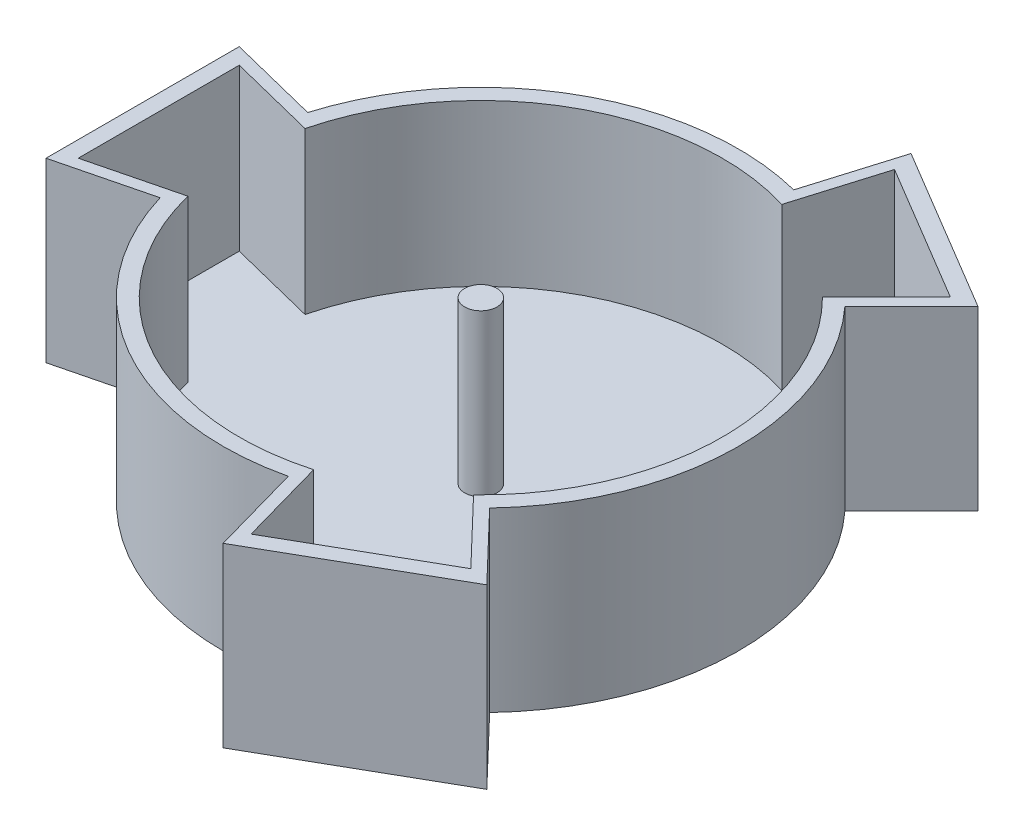
ISO-10303-21;
HEADER;
FILE_DESCRIPTION(('STEP AP214'),'2;1');
FILE_NAME('part.step','',(''),(''),'','','');
FILE_SCHEMA(('AUTOMOTIVE_DESIGN { 1 0 10303 214 1 1 1 1 }'));
ENDSEC;
DATA;
#1=APPLICATION_CONTEXT('core data for automotive mechanical design processes');
#2=APPLICATION_PROTOCOL_DEFINITION('international standard','automotive_design',2000,#1);
#3=PRODUCT_CONTEXT('',#1,'mechanical');
#4=PRODUCT('Part','Part','',(#3));
#5=PRODUCT_RELATED_PRODUCT_CATEGORY('part','',(#4));
#6=PRODUCT_DEFINITION_FORMATION('','',#4);
#7=PRODUCT_DEFINITION_CONTEXT('part definition',#1,'design');
#8=PRODUCT_DEFINITION('design','',#6,#7);
#9=PRODUCT_DEFINITION_SHAPE('','',#8);
#10=(LENGTH_UNIT() NAMED_UNIT(*) SI_UNIT(.MILLI.,.METRE.));
#11=(NAMED_UNIT(*) PLANE_ANGLE_UNIT() SI_UNIT($,.RADIAN.));
#12=(NAMED_UNIT(*) SI_UNIT($,.STERADIAN.) SOLID_ANGLE_UNIT());
#13=UNCERTAINTY_MEASURE_WITH_UNIT(LENGTH_MEASURE(1.E-05),#10,'distance_accuracy_value','');
#14=(GEOMETRIC_REPRESENTATION_CONTEXT(3) GLOBAL_UNCERTAINTY_ASSIGNED_CONTEXT((#13)) GLOBAL_UNIT_ASSIGNED_CONTEXT((#10,
#11,#12)) REPRESENTATION_CONTEXT('',''));
#15=CARTESIAN_POINT('',(0.,0.,0.));
#16=DIRECTION('',(0.,0.,1.));
#17=DIRECTION('',(1.,0.,0.));
#18=AXIS2_PLACEMENT_3D('',#15,#16,#17);
#19=CARTESIAN_POINT('',(1.3343295867125,25.4,-1.27871712868801));
#20=DIRECTION('',(-0.721992365538374,0.,0.691901021898582));
#21=DIRECTION('',(0.691901021898582,0.,0.721992365538374));
#22=AXIS2_PLACEMENT_3D('',#19,#20,#21);
#23=PLANE('',#22);
#24=DIRECTION('',(0.,-1.,0.));
#25=VECTOR('',#24,1.);
#26=CARTESIAN_POINT('',(39.6958434473528,25.4,38.7511704726871));
#27=LINE('',#26,#25);
#28=CARTESIAN_POINT('',(39.6958434473528,25.4,38.7511704726871));
#29=VERTEX_POINT('',#28);
#30=CARTESIAN_POINT('',(39.6958434473528,-2.54,38.7511704726871));
#31=VERTEX_POINT('',#30);
#32=EDGE_CURVE('E259',#29,#31,#27,.T.);
#33=ORIENTED_EDGE('',*,*,#32,.T.);
#34=DIRECTION('',(-0.691901021898582,0.,-0.721992365538374));
#35=VECTOR('',#34,1.);
#36=CARTESIAN_POINT('',(1.3343295867125,-2.54,-1.27871712868801));
#37=LINE('',#36,#35);
#38=CARTESIAN_POINT('',(29.424096963729,-2.54,28.032697299209));
#39=VERTEX_POINT('',#38);
#40=EDGE_CURVE('E760',#31,#39,#37,.T.);
#41=ORIENTED_EDGE('',*,*,#40,.T.);
#42=DIRECTION('',(0.,-1.,0.));
#43=VECTOR('',#42,1.);
#44=CARTESIAN_POINT('',(29.424096963729,25.4,28.032697299209));
#45=LINE('',#44,#43);
#46=CARTESIAN_POINT('',(29.424096963729,25.4,28.032697299209));
#47=VERTEX_POINT('',#46);
#48=EDGE_CURVE('E11',#47,#39,#45,.T.);
#49=ORIENTED_EDGE('',*,*,#48,.F.);
#50=DIRECTION('',(-0.691901021898582,0.,-0.721992365538374));
#51=VECTOR('',#50,1.);
#52=CARTESIAN_POINT('',(1.3343295867125,25.4,-1.27871712868801));
#53=LINE('',#52,#51);
#54=EDGE_CURVE('E381',#29,#47,#53,.T.);
#55=ORIENTED_EDGE('',*,*,#54,.F.);
#56=EDGE_LOOP('',(#33,#41,#49,#55));
#57=FACE_BOUND('',#56,.T.);
#58=ADVANCED_FACE('F50',(#57),#23,.F.);
#59=CARTESIAN_POINT('',(0.,25.4,0.));
#60=DIRECTION('',(0.,-1.,0.));
#61=DIRECTION('',(0.,0.,-1.));
#62=AXIS2_PLACEMENT_3D('',#59,#60,#61);
#63=CYLINDRICAL_SURFACE('',#62,40.64);
#64=ORIENTED_EDGE('',*,*,#48,.T.);
#65=CARTESIAN_POINT('',(0.,-2.54,0.));
#66=DIRECTION('',(0.,1.,0.));
#67=DIRECTION('',(0.,0.,1.));
#68=AXIS2_PLACEMENT_3D('',#65,#66,#67);
#69=CIRCLE('',#68,40.64);
#70=CARTESIAN_POINT('',(29.9423411842583,-2.54,-27.4784607357375));
#71=VERTEX_POINT('',#70);
#72=EDGE_CURVE('E746',#39,#71,#69,.T.);
#73=ORIENTED_EDGE('',*,*,#72,.T.);
#74=DIRECTION('',(0.,-1.,0.));
#75=VECTOR('',#74,1.);
#76=CARTESIAN_POINT('',(29.9423411842583,25.4,-27.4784607357375));
#77=LINE('',#76,#75);
#78=CARTESIAN_POINT('',(29.9423411842583,25.4,-27.4784607357375));
#79=VERTEX_POINT('',#78);
#80=EDGE_CURVE('E59',#79,#71,#77,.T.);
#81=ORIENTED_EDGE('',*,*,#80,.F.);
#82=CARTESIAN_POINT('',(0.,25.4,0.));
#83=DIRECTION('',(0.,1.,0.));
#84=DIRECTION('',(0.,0.,1.));
#85=AXIS2_PLACEMENT_3D('',#82,#83,#84);
#86=CIRCLE('',#85,40.64);
#87=EDGE_CURVE('E383',#47,#79,#86,.T.);
#88=ORIENTED_EDGE('',*,*,#87,.F.);
#89=EDGE_LOOP('',(#64,#73,#81,#88));
#90=FACE_BOUND('',#89,.T.);
#91=ADVANCED_FACE('F453',(#90),#63,.T.);
#92=CARTESIAN_POINT('',(1.31022325226551,25.4,1.30340629521237));
#93=DIRECTION('',(0.708948669584124,0.,0.705260082448241));
#94=DIRECTION('',(0.705260082448241,0.,-0.708948669584124));
#95=AXIS2_PLACEMENT_3D('',#92,#93,#94);
#96=PLANE('',#95);
#97=ORIENTED_EDGE('',*,*,#80,.T.);
#98=DIRECTION('',(-0.705260082448241,0.,0.708948669584124));
#99=VECTOR('',#98,1.);
#100=CARTESIAN_POINT('',(1.31022325226551,-2.54,1.30340629521237));
#101=LINE('',#100,#99);
#102=CARTESIAN_POINT('',(40.4124121086366,-2.54,-38.0032912727532));
#103=VERTEX_POINT('',#102);
#104=EDGE_CURVE('E740',#103,#71,#101,.T.);
#105=ORIENTED_EDGE('',*,*,#104,.F.);
#106=DIRECTION('',(0.,-1.,0.));
#107=VECTOR('',#106,1.);
#108=CARTESIAN_POINT('',(40.4124121086366,25.4,-38.0032912727532));
#109=LINE('',#108,#107);
#110=CARTESIAN_POINT('',(40.4124121086366,25.4,-38.0032912727532));
#111=VERTEX_POINT('',#110);
#112=EDGE_CURVE('E290',#111,#103,#109,.T.);
#113=ORIENTED_EDGE('',*,*,#112,.F.);
#114=DIRECTION('',(-0.705260082448241,0.,0.708948669584124));
#115=VECTOR('',#114,1.);
#116=CARTESIAN_POINT('',(1.31022325226551,25.4,1.30340629521237));
#117=LINE('',#116,#115);
#118=EDGE_CURVE('E390',#111,#79,#117,.T.);
#119=ORIENTED_EDGE('',*,*,#118,.T.);
#120=EDGE_LOOP('',(#97,#105,#113,#119));
#121=FACE_BOUND('',#120,.T.);
#122=ADVANCED_FACE('F461',(#121),#96,.T.);
#123=CARTESIAN_POINT('',(27.3238135000878,25.4,-45.8100951299211));
#124=DIRECTION('',(0.512257470942778,0.,-0.858831929694809));
#125=DIRECTION('',(-0.858831929694809,0.,-0.512257470942778));
#126=AXIS2_PLACEMENT_3D('',#123,#124,#125);
#127=PLANE('',#126);
#128=ORIENTED_EDGE('',*,*,#112,.T.);
#129=DIRECTION('',(0.858831929694809,0.,0.512257470942778));
#130=VECTOR('',#129,1.);
#131=CARTESIAN_POINT('',(27.3238135000878,-2.54,-45.8100951299211));
#132=LINE('',#131,#130);
#133=CARTESIAN_POINT('',(14.2352148915389,-2.54,-53.616898987089));
#134=VERTEX_POINT('',#133);
#135=EDGE_CURVE('E755',#134,#103,#132,.T.);
#136=ORIENTED_EDGE('',*,*,#135,.F.);
#137=DIRECTION('',(0.,-1.,0.));
#138=VECTOR('',#137,1.);
#139=CARTESIAN_POINT('',(14.2352148915389,25.4,-53.616898987089));
#140=LINE('',#139,#138);
#141=CARTESIAN_POINT('',(14.2352148915389,25.4,-53.616898987089));
#142=VERTEX_POINT('',#141);
#143=EDGE_CURVE('E284',#142,#134,#140,.T.);
#144=ORIENTED_EDGE('',*,*,#143,.F.);
#145=DIRECTION('',(0.858831929694809,0.,0.512257470942778));
#146=VECTOR('',#145,1.);
#147=CARTESIAN_POINT('',(27.3238135000878,25.4,-45.8100951299211));
#148=LINE('',#147,#146);
#149=EDGE_CURVE('E391',#142,#111,#148,.T.);
#150=ORIENTED_EDGE('',*,*,#149,.T.);
#151=EDGE_LOOP('',(#128,#136,#144,#150));
#152=FACE_BOUND('',#151,.T.);
#153=ADVANCED_FACE('F664',(#152),#127,.T.);
#154=CARTESIAN_POINT('',(-1.76944700856951,25.4,-0.533488730003613));
#155=DIRECTION('',(0.9574300413734,0.,0.288665404708861));
#156=DIRECTION('',(0.288665404708861,0.,-0.9574300413734));
#157=AXIS2_PLACEMENT_3D('',#154,#155,#156);
#158=PLANE('',#157);
#159=ORIENTED_EDGE('',*,*,#143,.T.);
#160=DIRECTION('',(-0.288665404708861,0.,0.9574300413734));
#161=VECTOR('',#160,1.);
#162=CARTESIAN_POINT('',(-1.76944700856951,-2.54,-0.533488730003613));
#163=LINE('',#162,#161);
#164=CARTESIAN_POINT('',(9.94977844627125,-2.54,-39.4031916076619));
#165=VERTEX_POINT('',#164);
#166=EDGE_CURVE('E766',#134,#165,#163,.T.);
#167=ORIENTED_EDGE('',*,*,#166,.T.);
#168=DIRECTION('',(0.,-1.,0.));
#169=VECTOR('',#168,1.);
#170=CARTESIAN_POINT('',(9.94977844627125,25.4,-39.4031916076619));
#171=LINE('',#170,#169);
#172=CARTESIAN_POINT('',(9.94977844627125,25.4,-39.4031916076619));
#173=VERTEX_POINT('',#172);
#174=EDGE_CURVE('E276',#173,#165,#171,.T.);
#175=ORIENTED_EDGE('',*,*,#174,.F.);
#176=DIRECTION('',(-0.288665404708861,0.,0.9574300413734));
#177=VECTOR('',#176,1.);
#178=CARTESIAN_POINT('',(-1.76944700856951,25.4,-0.533488730003613));
#179=LINE('',#178,#177);
#180=EDGE_CURVE('E395',#142,#173,#179,.T.);
#181=ORIENTED_EDGE('',*,*,#180,.F.);
#182=EDGE_LOOP('',(#159,#167,#175,#181));
#183=FACE_BOUND('',#182,.T.);
#184=ADVANCED_FACE('F653',(#183),#158,.F.);
#185=CARTESIAN_POINT('',(0.,25.4,0.));
#186=DIRECTION('',(0.,-1.,0.));
#187=DIRECTION('',(0.,0.,-1.));
#188=AXIS2_PLACEMENT_3D('',#185,#186,#187);
#189=CYLINDRICAL_SURFACE('',#188,40.64);
#190=ORIENTED_EDGE('',*,*,#174,.T.);
#191=CARTESIAN_POINT('',(0.,-2.54,0.));
#192=DIRECTION('',(0.,1.,0.));
#193=DIRECTION('',(0.,0.,1.));
#194=AXIS2_PLACEMENT_3D('',#191,#192,#193);
#195=CIRCLE('',#194,40.64);
#196=CARTESIAN_POINT('',(-38.9375674278704,-2.54,-11.6393918569676));
#197=VERTEX_POINT('',#196);
#198=EDGE_CURVE('E769',#165,#197,#195,.T.);
#199=ORIENTED_EDGE('',*,*,#198,.T.);
#200=DIRECTION('',(0.,-1.,0.));
#201=VECTOR('',#200,1.);
#202=CARTESIAN_POINT('',(-38.9375674278704,25.4,-11.6393918569676));
#203=LINE('',#202,#201);
#204=CARTESIAN_POINT('',(-38.9375674278704,25.4,-11.6393918569676));
#205=VERTEX_POINT('',#204);
#206=EDGE_CURVE('E274',#205,#197,#203,.T.);
#207=ORIENTED_EDGE('',*,*,#206,.F.);
#208=CARTESIAN_POINT('',(0.,25.4,0.));
#209=DIRECTION('',(0.,1.,0.));
#210=DIRECTION('',(0.,0.,1.));
#211=AXIS2_PLACEMENT_3D('',#208,#209,#210);
#212=CIRCLE('',#211,40.64);
#213=EDGE_CURVE('E397',#173,#205,#212,.T.);
#214=ORIENTED_EDGE('',*,*,#213,.F.);
#215=EDGE_LOOP('',(#190,#199,#207,#214));
#216=FACE_BOUND('',#215,.T.);
#217=ADVANCED_FACE('F641',(#216),#189,.T.);
#218=CARTESIAN_POINT('',(0.448235294117646,25.4,-1.79294117647058));
#219=DIRECTION('',(0.242535625036333,0.,-0.970142500145332));
#220=DIRECTION('',(-0.970142500145332,0.,-0.242535625036333));
#221=AXIS2_PLACEMENT_3D('',#218,#219,#220);
#222=PLANE('',#221);
#223=ORIENTED_EDGE('',*,*,#206,.T.);
#224=DIRECTION('',(0.970142500145332,0.,0.242535625036333));
#225=VECTOR('',#224,1.);
#226=CARTESIAN_POINT('',(0.448235294117646,-2.54,-1.79294117647058));
#227=LINE('',#226,#225);
#228=CARTESIAN_POINT('',(-53.34,-2.54,-15.24));
#229=VERTEX_POINT('',#228);
#230=EDGE_CURVE('E771',#229,#197,#227,.T.);
#231=ORIENTED_EDGE('',*,*,#230,.F.);
#232=DIRECTION('',(0.,-1.,0.));
#233=VECTOR('',#232,1.);
#234=CARTESIAN_POINT('',(-53.34,25.4,-15.24));
#235=LINE('',#234,#233);
#236=CARTESIAN_POINT('',(-53.34,25.4,-15.24));
#237=VERTEX_POINT('',#236);
#238=EDGE_CURVE('E271',#237,#229,#235,.T.);
#239=ORIENTED_EDGE('',*,*,#238,.F.);
#240=DIRECTION('',(0.970142500145332,0.,0.242535625036333));
#241=VECTOR('',#240,1.);
#242=CARTESIAN_POINT('',(0.448235294117646,25.4,-1.79294117647058));
#243=LINE('',#242,#241);
#244=EDGE_CURVE('E402',#237,#205,#243,.T.);
#245=ORIENTED_EDGE('',*,*,#244,.T.);
#246=EDGE_LOOP('',(#223,#231,#239,#245));
#247=FACE_BOUND('',#246,.T.);
#248=ADVANCED_FACE('F632',(#247),#222,.T.);
#249=CARTESIAN_POINT('',(-53.34,25.4,0.));
#250=DIRECTION('',(1.,0.,0.));
#251=DIRECTION('',(0.,0.,-1.));
#252=AXIS2_PLACEMENT_3D('',#249,#250,#251);
#253=PLANE('',#252);
#254=ORIENTED_EDGE('',*,*,#238,.T.);
#255=DIRECTION('',(0.,0.,1.));
#256=VECTOR('',#255,1.);
#257=CARTESIAN_POINT('',(-53.34,-2.54,0.));
#258=LINE('',#257,#256);
#259=CARTESIAN_POINT('',(-53.34,-2.54,15.24));
#260=VERTEX_POINT('',#259);
#261=EDGE_CURVE('E779',#229,#260,#258,.T.);
#262=ORIENTED_EDGE('',*,*,#261,.T.);
#263=DIRECTION('',(0.,-1.,0.));
#264=VECTOR('',#263,1.);
#265=CARTESIAN_POINT('',(-53.34,25.4,15.24));
#266=LINE('',#265,#264);
#267=CARTESIAN_POINT('',(-53.34,25.4,15.24));
#268=VERTEX_POINT('',#267);
#269=EDGE_CURVE('E270',#268,#260,#266,.T.);
#270=ORIENTED_EDGE('',*,*,#269,.F.);
#271=DIRECTION('',(0.,0.,1.));
#272=VECTOR('',#271,1.);
#273=CARTESIAN_POINT('',(-53.34,25.4,0.));
#274=LINE('',#273,#272);
#275=EDGE_CURVE('E403',#237,#268,#274,.T.);
#276=ORIENTED_EDGE('',*,*,#275,.F.);
#277=EDGE_LOOP('',(#254,#262,#270,#276));
#278=FACE_BOUND('',#277,.T.);
#279=ADVANCED_FACE('F621',(#278),#253,.F.);
#280=CARTESIAN_POINT('',(0.448235294117648,25.4,1.79294117647059));
#281=DIRECTION('',(-0.242535625036333,0.,-0.970142500145332));
#282=DIRECTION('',(-0.970142500145332,0.,0.242535625036333));
#283=AXIS2_PLACEMENT_3D('',#280,#281,#282);
#284=PLANE('',#283);
#285=ORIENTED_EDGE('',*,*,#269,.T.);
#286=DIRECTION('',(0.970142500145332,0.,-0.242535625036333));
#287=VECTOR('',#286,1.);
#288=CARTESIAN_POINT('',(0.448235294117648,-2.54,1.79294117647059));
#289=LINE('',#288,#287);
#290=CARTESIAN_POINT('',(-38.9375674278704,-2.54,11.6393918569676));
#291=VERTEX_POINT('',#290);
#292=EDGE_CURVE('E785',#260,#291,#289,.T.);
#293=ORIENTED_EDGE('',*,*,#292,.T.);
#294=DIRECTION('',(0.,-1.,0.));
#295=VECTOR('',#294,1.);
#296=CARTESIAN_POINT('',(-38.9375674278704,25.4,11.6393918569676));
#297=LINE('',#296,#295);
#298=CARTESIAN_POINT('',(-38.9375674278704,25.4,11.6393918569676));
#299=VERTEX_POINT('',#298);
#300=EDGE_CURVE('E210',#299,#291,#297,.T.);
#301=ORIENTED_EDGE('',*,*,#300,.F.);
#302=DIRECTION('',(0.970142500145332,0.,-0.242535625036333));
#303=VECTOR('',#302,1.);
#304=CARTESIAN_POINT('',(0.448235294117648,25.4,1.79294117647059));
#305=LINE('',#304,#303);
#306=EDGE_CURVE('E190',#268,#299,#305,.T.);
#307=ORIENTED_EDGE('',*,*,#306,.F.);
#308=EDGE_LOOP('',(#285,#293,#301,#307));
#309=FACE_BOUND('',#308,.T.);
#310=ADVANCED_FACE('F613',(#309),#284,.F.);
#311=CARTESIAN_POINT('',(0.,25.4,0.));
#312=DIRECTION('',(0.,-1.,0.));
#313=DIRECTION('',(0.,0.,-1.));
#314=AXIS2_PLACEMENT_3D('',#311,#312,#313);
#315=CYLINDRICAL_SURFACE('',#314,40.64);
#316=ORIENTED_EDGE('',*,*,#300,.T.);
#317=CARTESIAN_POINT('',(0.,-2.54,0.));
#318=DIRECTION('',(0.,1.,0.));
#319=DIRECTION('',(0.,0.,1.));
#320=AXIS2_PLACEMENT_3D('',#317,#318,#319);
#321=CIRCLE('',#320,40.64);
#322=CARTESIAN_POINT('',(9.21238320011056,-2.54,39.5820868041886));
#323=VERTEX_POINT('',#322);
#324=EDGE_CURVE('E205',#291,#323,#321,.T.);
#325=ORIENTED_EDGE('',*,*,#324,.T.);
#326=DIRECTION('',(0.,-1.,0.));
#327=VECTOR('',#326,1.);
#328=CARTESIAN_POINT('',(9.21238320011056,25.4,39.5820868041886));
#329=LINE('',#328,#327);
#330=CARTESIAN_POINT('',(9.21238320011056,25.4,39.5820868041886));
#331=VERTEX_POINT('',#330);
#332=EDGE_CURVE('E196',#331,#323,#329,.T.);
#333=ORIENTED_EDGE('',*,*,#332,.F.);
#334=CARTESIAN_POINT('',(0.,25.4,0.));
#335=DIRECTION('',(0.,1.,0.));
#336=DIRECTION('',(0.,0.,1.));
#337=AXIS2_PLACEMENT_3D('',#334,#335,#336);
#338=CIRCLE('',#337,40.64);
#339=EDGE_CURVE('E184',#299,#331,#338,.T.);
#340=ORIENTED_EDGE('',*,*,#339,.F.);
#341=EDGE_LOOP('',(#316,#325,#333,#340));
#342=FACE_BOUND('',#341,.T.);
#343=ADVANCED_FACE('F200',(#342),#315,.T.);
#344=CARTESIAN_POINT('',(-1.7790988723642,25.4,0.500360013918826));
#345=DIRECTION('',(-0.962652568133193,0.,0.270739788480691));
#346=DIRECTION('',(0.270739788480691,0.,0.962652568133193));
#347=AXIS2_PLACEMENT_3D('',#344,#345,#346);
#348=PLANE('',#347);
#349=ORIENTED_EDGE('',*,*,#332,.T.);
#350=DIRECTION('',(-0.270739788480691,0.,-0.962652568133193));
#351=VECTOR('',#350,1.);
#352=CARTESIAN_POINT('',(-1.7790988723642,-2.54,0.500360013918826));
#353=LINE('',#352,#351);
#354=CARTESIAN_POINT('',(13.2317015452007,-2.54,53.8733261848453));
#355=VERTEX_POINT('',#354);
#356=EDGE_CURVE('E786',#355,#323,#353,.T.);
#357=ORIENTED_EDGE('',*,*,#356,.F.);
#358=DIRECTION('',(0.,-1.,0.));
#359=VECTOR('',#358,1.);
#360=CARTESIAN_POINT('',(13.2317015452007,25.4,53.8733261848453));
#361=LINE('',#360,#359);
#362=CARTESIAN_POINT('',(13.2317015452007,25.4,53.8733261848453));
#363=VERTEX_POINT('',#362);
#364=EDGE_CURVE('E208',#363,#355,#361,.T.);
#365=ORIENTED_EDGE('',*,*,#364,.F.);
#366=DIRECTION('',(-0.270739788480691,0.,-0.962652568133193));
#367=VECTOR('',#366,1.);
#368=CARTESIAN_POINT('',(-1.7790988723642,25.4,0.500360013918826));
#369=LINE('',#368,#367);
#370=EDGE_CURVE('E189',#363,#331,#369,.T.);
#371=ORIENTED_EDGE('',*,*,#370,.T.);
#372=EDGE_LOOP('',(#349,#357,#365,#371));
#373=FACE_BOUND('',#372,.T.);
#374=ADVANCED_FACE('F209',(#373),#348,.T.);
#375=CARTESIAN_POINT('',(0.,25.4,0.));
#376=DIRECTION('',(0.,-1.,0.));
#377=DIRECTION('',(0.,0.,-1.));
#378=AXIS2_PLACEMENT_3D('',#375,#376,#377);
#379=CYLINDRICAL_SURFACE('',#378,38.1);
#380=CARTESIAN_POINT('',(0.,0.,0.));
#381=DIRECTION('',(0.,1.,0.));
#382=DIRECTION('',(0.,0.,1.));
#383=AXIS2_PLACEMENT_3D('',#380,#381,#382);
#384=CIRCLE('',#383,38.1);
#385=CARTESIAN_POINT('',(26.361428934336,0.,27.5079091270121));
#386=VERTEX_POINT('',#385);
#387=CARTESIAN_POINT('',(26.870409141278,0.,-27.0109443111551));
#388=VERTEX_POINT('',#387);
#389=EDGE_CURVE('E217',#386,#388,#384,.T.);
#390=ORIENTED_EDGE('',*,*,#389,.F.);
#391=DIRECTION('',(0.,-1.,0.));
#392=VECTOR('',#391,1.);
#393=CARTESIAN_POINT('',(26.361428934336,25.4,27.5079091270121));
#394=LINE('',#393,#392);
#395=CARTESIAN_POINT('',(26.361428934336,25.4,27.5079091270121));
#396=VERTEX_POINT('',#395);
#397=EDGE_CURVE('E51',#396,#386,#394,.T.);
#398=ORIENTED_EDGE('',*,*,#397,.F.);
#399=CARTESIAN_POINT('',(0.,25.4,0.));
#400=DIRECTION('',(0.,1.,0.));
#401=DIRECTION('',(0.,0.,1.));
#402=AXIS2_PLACEMENT_3D('',#399,#400,#401);
#403=CIRCLE('',#402,38.1);
#404=CARTESIAN_POINT('',(26.870409141278,25.4,-27.0109443111551));
#405=VERTEX_POINT('',#404);
#406=EDGE_CURVE('E256',#396,#405,#403,.T.);
#407=ORIENTED_EDGE('',*,*,#406,.T.);
#408=DIRECTION('',(0.,-1.,0.));
#409=VECTOR('',#408,1.);
#410=CARTESIAN_POINT('',(26.870409141278,25.4,-27.0109443111551));
#411=LINE('',#410,#409);
#412=EDGE_CURVE('E111',#405,#388,#411,.T.);
#413=ORIENTED_EDGE('',*,*,#412,.T.);
#414=EDGE_LOOP('',(#390,#398,#407,#413));
#415=FACE_BOUND('',#414,.T.);
#416=ADVANCED_FACE('F413',(#415),#379,.F.);
#417=CARTESIAN_POINT('',(0.,25.4,0.));
#418=DIRECTION('',(-0.721992365538373,0.,0.691901021898583));
#419=DIRECTION('',(0.691901021898583,0.,0.721992365538373));
#420=AXIS2_PLACEMENT_3D('',#417,#418,#419);
#421=PLANE('',#420);
#422=DIRECTION('',(-0.691901021898583,0.,-0.721992365538373));
#423=VECTOR('',#422,1.);
#424=CARTESIAN_POINT('',(0.,0.,0.));
#425=LINE('',#424,#423);
#426=CARTESIAN_POINT('',(36.2303186461603,0.,37.8060049568543));
#427=VERTEX_POINT('',#426);
#428=EDGE_CURVE('E225',#427,#386,#425,.T.);
#429=ORIENTED_EDGE('',*,*,#428,.F.);
#430=DIRECTION('',(0.,-1.,0.));
#431=VECTOR('',#430,1.);
#432=CARTESIAN_POINT('',(36.2303186461603,25.4,37.8060049568543));
#433=LINE('',#432,#431);
#434=CARTESIAN_POINT('',(36.2303186461603,25.4,37.8060049568543));
#435=VERTEX_POINT('',#434);
#436=EDGE_CURVE('E325',#435,#427,#433,.T.);
#437=ORIENTED_EDGE('',*,*,#436,.F.);
#438=DIRECTION('',(-0.691901021898583,0.,-0.721992365538373));
#439=VECTOR('',#438,1.);
#440=CARTESIAN_POINT('',(0.,25.4,0.));
#441=LINE('',#440,#439);
#442=EDGE_CURVE('E335',#435,#396,#441,.T.);
#443=ORIENTED_EDGE('',*,*,#442,.T.);
#444=ORIENTED_EDGE('',*,*,#397,.T.);
#445=EDGE_LOOP('',(#429,#437,#443,#444));
#446=FACE_BOUND('',#445,.T.);
#447=ADVANCED_FACE('F47',(#446),#421,.T.);
#448=CARTESIAN_POINT('',(25.2035928535969,25.4,44.1069031702535));
#449=DIRECTION('',(-0.496133717590491,0.,-0.868246125398691));
#450=DIRECTION('',(-0.868246125398691,0.,0.496133717590491));
#451=AXIS2_PLACEMENT_3D('',#448,#449,#450);
#452=PLANE('',#451);
#453=DIRECTION('',(0.868246125398691,0.,-0.496133717590491));
#454=VECTOR('',#453,1.);
#455=CARTESIAN_POINT('',(25.2035928535969,0.,44.1069031702535));
#456=LINE('',#455,#454);
#457=CARTESIAN_POINT('',(14.1768670610335,0.,50.4078013836527));
#458=VERTEX_POINT('',#457);
#459=EDGE_CURVE('E228',#458,#427,#456,.T.);
#460=ORIENTED_EDGE('',*,*,#459,.F.);
#461=DIRECTION('',(0.,-1.,0.));
#462=VECTOR('',#461,1.);
#463=CARTESIAN_POINT('',(14.1768670610335,25.4,50.4078013836527));
#464=LINE('',#463,#462);
#465=CARTESIAN_POINT('',(14.1768670610335,25.4,50.4078013836527));
#466=VERTEX_POINT('',#465);
#467=EDGE_CURVE('E319',#466,#458,#464,.T.);
#468=ORIENTED_EDGE('',*,*,#467,.F.);
#469=DIRECTION('',(0.868246125398691,0.,-0.496133717590491));
#470=VECTOR('',#469,1.);
#471=CARTESIAN_POINT('',(25.2035928535969,25.4,44.1069031702535));
#472=LINE('',#471,#470);
#473=EDGE_CURVE('E345',#466,#435,#472,.T.);
#474=ORIENTED_EDGE('',*,*,#473,.T.);
#475=ORIENTED_EDGE('',*,*,#436,.T.);
#476=EDGE_LOOP('',(#460,#468,#474,#475));
#477=FACE_BOUND('',#476,.T.);
#478=ADVANCED_FACE('F338',(#477),#452,.T.);
#479=CARTESIAN_POINT('',(0.,25.4,0.));
#480=DIRECTION('',(-0.962652568133193,0.,0.270739788480691));
#481=DIRECTION('',(0.270739788480691,0.,0.962652568133193));
#482=AXIS2_PLACEMENT_3D('',#479,#480,#481);
#483=PLANE('',#482);
#484=DIRECTION('',(-0.27073978848069,0.,-0.962652568133193));
#485=VECTOR('',#484,1.);
#486=CARTESIAN_POINT('',(0.,0.,0.));
#487=LINE('',#486,#485);
#488=CARTESIAN_POINT('',(10.3151859411143,0.,36.6770628458746));
#489=VERTEX_POINT('',#488);
#490=EDGE_CURVE('E232',#458,#489,#487,.T.);
#491=ORIENTED_EDGE('',*,*,#490,.T.);
#492=DIRECTION('',(0.,-1.,0.));
#493=VECTOR('',#492,1.);
#494=CARTESIAN_POINT('',(10.3151859411143,25.4,36.6770628458746));
#495=LINE('',#494,#493);
#496=CARTESIAN_POINT('',(10.3151859411143,25.4,36.6770628458746));
#497=VERTEX_POINT('',#496);
#498=EDGE_CURVE('E320',#497,#489,#495,.T.);
#499=ORIENTED_EDGE('',*,*,#498,.F.);
#500=DIRECTION('',(-0.27073978848069,0.,-0.962652568133193));
#501=VECTOR('',#500,1.);
#502=CARTESIAN_POINT('',(0.,25.4,0.));
#503=LINE('',#502,#501);
#504=EDGE_CURVE('E344',#466,#497,#503,.T.);
#505=ORIENTED_EDGE('',*,*,#504,.F.);
#506=ORIENTED_EDGE('',*,*,#467,.T.);
#507=EDGE_LOOP('',(#491,#499,#505,#506));
#508=FACE_BOUND('',#507,.T.);
#509=ADVANCED_FACE('F347',(#508),#483,.F.);
#510=CARTESIAN_POINT('',(-36.9624292555371,0.,9.24060731388429));
#511=VERTEX_POINT('',#510);
#512=EDGE_CURVE('E223',#511,#489,#384,.T.);
#513=ORIENTED_EDGE('',*,*,#512,.F.);
#514=DIRECTION('',(0.,-1.,0.));
#515=VECTOR('',#514,1.);
#516=CARTESIAN_POINT('',(-36.9624292555371,25.4,9.24060731388429));
#517=LINE('',#516,#515);
#518=CARTESIAN_POINT('',(-36.9624292555371,25.4,9.24060731388429));
#519=VERTEX_POINT('',#518);
#520=EDGE_CURVE('E314',#519,#511,#517,.T.);
#521=ORIENTED_EDGE('',*,*,#520,.F.);
#522=EDGE_CURVE('E351',#519,#497,#403,.T.);
#523=ORIENTED_EDGE('',*,*,#522,.T.);
#524=ORIENTED_EDGE('',*,*,#498,.T.);
#525=EDGE_LOOP('',(#513,#521,#523,#524));
#526=FACE_BOUND('',#525,.T.);
#527=ADVANCED_FACE('F432',(#526),#379,.F.);
#528=CARTESIAN_POINT('',(0.,25.4,0.));
#529=DIRECTION('',(-0.242535625036333,0.,-0.970142500145332));
#530=DIRECTION('',(-0.970142500145332,0.,0.242535625036333));
#531=AXIS2_PLACEMENT_3D('',#528,#529,#530);
#532=PLANE('',#531);
#533=DIRECTION('',(0.970142500145332,0.,-0.242535625036333));
#534=VECTOR('',#533,1.);
#535=CARTESIAN_POINT('',(0.,0.,0.));
#536=LINE('',#535,#534);
#537=CARTESIAN_POINT('',(-50.8,0.,12.7));
#538=VERTEX_POINT('',#537);
#539=EDGE_CURVE('E240',#538,#511,#536,.T.);
#540=ORIENTED_EDGE('',*,*,#539,.F.);
#541=DIRECTION('',(0.,-1.,0.));
#542=VECTOR('',#541,1.);
#543=CARTESIAN_POINT('',(-50.8,25.4,12.7));
#544=LINE('',#543,#542);
#545=CARTESIAN_POINT('',(-50.8,25.4,12.7));
#546=VERTEX_POINT('',#545);
#547=EDGE_CURVE('E313',#546,#538,#544,.T.);
#548=ORIENTED_EDGE('',*,*,#547,.F.);
#549=DIRECTION('',(0.970142500145332,0.,-0.242535625036333));
#550=VECTOR('',#549,1.);
#551=CARTESIAN_POINT('',(0.,25.4,0.));
#552=LINE('',#551,#550);
#553=EDGE_CURVE('E358',#546,#519,#552,.T.);
#554=ORIENTED_EDGE('',*,*,#553,.T.);
#555=ORIENTED_EDGE('',*,*,#520,.T.);
#556=EDGE_LOOP('',(#540,#548,#554,#555));
#557=FACE_BOUND('',#556,.T.);
#558=ADVANCED_FACE('F437',(#557),#532,.T.);
#559=CARTESIAN_POINT('',(-50.8,25.4,0.));
#560=DIRECTION('',(1.,0.,0.));
#561=DIRECTION('',(0.,0.,-1.));
#562=AXIS2_PLACEMENT_3D('',#559,#560,#561);
#563=PLANE('',#562);
#564=DIRECTION('',(0.,0.,1.));
#565=VECTOR('',#564,1.);
#566=CARTESIAN_POINT('',(-50.8,0.,0.));
#567=LINE('',#566,#565);
#568=CARTESIAN_POINT('',(-50.8,0.,-12.7));
#569=VERTEX_POINT('',#568);
#570=EDGE_CURVE('E241',#569,#538,#567,.T.);
#571=ORIENTED_EDGE('',*,*,#570,.F.);
#572=DIRECTION('',(0.,-1.,0.));
#573=VECTOR('',#572,1.);
#574=CARTESIAN_POINT('',(-50.8,25.4,-12.7));
#575=LINE('',#574,#573);
#576=CARTESIAN_POINT('',(-50.8,25.4,-12.7));
#577=VERTEX_POINT('',#576);
#578=EDGE_CURVE('E306',#577,#569,#575,.T.);
#579=ORIENTED_EDGE('',*,*,#578,.F.);
#580=DIRECTION('',(0.,0.,1.));
#581=VECTOR('',#580,1.);
#582=CARTESIAN_POINT('',(-50.8,25.4,0.));
#583=LINE('',#582,#581);
#584=EDGE_CURVE('E361',#577,#546,#583,.T.);
#585=ORIENTED_EDGE('',*,*,#584,.T.);
#586=ORIENTED_EDGE('',*,*,#547,.T.);
#587=EDGE_LOOP('',(#571,#579,#585,#586));
#588=FACE_BOUND('',#587,.T.);
#589=ADVANCED_FACE('F442',(#588),#563,.T.);
#590=CARTESIAN_POINT('',(0.,25.4,0.));
#591=DIRECTION('',(0.242535625036333,0.,-0.970142500145332));
#592=DIRECTION('',(-0.970142500145332,0.,-0.242535625036333));
#593=AXIS2_PLACEMENT_3D('',#590,#591,#592);
#594=PLANE('',#593);
#595=DIRECTION('',(0.970142500145332,0.,0.242535625036333));
#596=VECTOR('',#595,1.);
#597=CARTESIAN_POINT('',(0.,0.,0.));
#598=LINE('',#597,#596);
#599=CARTESIAN_POINT('',(-36.9624292555371,0.,-9.24060731388428));
#600=VERTEX_POINT('',#599);
#601=EDGE_CURVE('E245',#569,#600,#598,.T.);
#602=ORIENTED_EDGE('',*,*,#601,.T.);
#603=DIRECTION('',(0.,-1.,0.));
#604=VECTOR('',#603,1.);
#605=CARTESIAN_POINT('',(-36.9624292555371,25.4,-9.24060731388428));
#606=LINE('',#605,#604);
#607=CARTESIAN_POINT('',(-36.9624292555371,25.4,-9.24060731388428));
#608=VERTEX_POINT('',#607);
#609=EDGE_CURVE('E304',#608,#600,#606,.T.);
#610=ORIENTED_EDGE('',*,*,#609,.F.);
#611=DIRECTION('',(0.970142500145332,0.,0.242535625036333));
#612=VECTOR('',#611,1.);
#613=CARTESIAN_POINT('',(0.,25.4,0.));
#614=LINE('',#613,#612);
#615=EDGE_CURVE('E370',#577,#608,#614,.T.);
#616=ORIENTED_EDGE('',*,*,#615,.F.);
#617=ORIENTED_EDGE('',*,*,#578,.T.);
#618=EDGE_LOOP('',(#602,#610,#616,#617));
#619=FACE_BOUND('',#618,.T.);
#620=ADVANCED_FACE('F441',(#619),#594,.F.);
#621=CARTESIAN_POINT('',(10.9981519194076,0.,-36.4780845763265));
#622=VERTEX_POINT('',#621);
#623=EDGE_CURVE('E221',#622,#600,#384,.T.);
#624=ORIENTED_EDGE('',*,*,#623,.F.);
#625=DIRECTION('',(0.,-1.,0.));
#626=VECTOR('',#625,1.);
#627=CARTESIAN_POINT('',(10.9981519194076,25.4,-36.4780845763265));
#628=LINE('',#627,#626);
#629=CARTESIAN_POINT('',(10.9981519194076,25.4,-36.4780845763265));
#630=VERTEX_POINT('',#629);
#631=EDGE_CURVE('E305',#630,#622,#628,.T.);
#632=ORIENTED_EDGE('',*,*,#631,.F.);
#633=EDGE_CURVE('E367',#630,#608,#403,.T.);
#634=ORIENTED_EDGE('',*,*,#633,.T.);
#635=ORIENTED_EDGE('',*,*,#609,.T.);
#636=EDGE_LOOP('',(#624,#632,#634,#635));
#637=FACE_BOUND('',#636,.T.);
#638=ADVANCED_FACE('F428',(#637),#379,.F.);
#639=CARTESIAN_POINT('',(0.,25.4,0.));
#640=DIRECTION('',(0.9574300413734,0.,0.28866540470886));
#641=DIRECTION('',(0.28866540470886,0.,-0.9574300413734));
#642=AXIS2_PLACEMENT_3D('',#639,#640,#641);
#643=PLANE('',#642);
#644=DIRECTION('',(-0.28866540470886,0.,0.9574300413734));
#645=VECTOR('',#644,1.);
#646=CARTESIAN_POINT('',(0.,0.,0.));
#647=LINE('',#646,#645);
#648=CARTESIAN_POINT('',(15.115514016769,0.,-50.1343319094696));
#649=VERTEX_POINT('',#648);
#650=EDGE_CURVE('E248',#649,#622,#647,.T.);
#651=ORIENTED_EDGE('',*,*,#650,.F.);
#652=DIRECTION('',(0.,-1.,0.));
#653=VECTOR('',#652,1.);
#654=CARTESIAN_POINT('',(15.115514016769,25.4,-50.1343319094696));
#655=LINE('',#654,#653);
#656=CARTESIAN_POINT('',(15.115514016769,25.4,-50.1343319094696));
#657=VERTEX_POINT('',#656);
#658=EDGE_CURVE('E298',#657,#649,#655,.T.);
#659=ORIENTED_EDGE('',*,*,#658,.F.);
#660=DIRECTION('',(-0.28866540470886,0.,0.9574300413734));
#661=VECTOR('',#660,1.);
#662=CARTESIAN_POINT('',(0.,25.4,0.));
#663=LINE('',#662,#661);
#664=EDGE_CURVE('E371',#657,#630,#663,.T.);
#665=ORIENTED_EDGE('',*,*,#664,.T.);
#666=ORIENTED_EDGE('',*,*,#631,.T.);
#667=EDGE_LOOP('',(#651,#659,#665,#666));
#668=FACE_BOUND('',#667,.T.);
#669=ADVANCED_FACE('F422',(#668),#643,.T.);
#670=CARTESIAN_POINT('',(26.0226795238931,25.4,-43.6286620284963));
#671=DIRECTION('',(0.512257470942777,0.,-0.858831929694809));
#672=DIRECTION('',(-0.858831929694809,0.,-0.512257470942777));
#673=AXIS2_PLACEMENT_3D('',#670,#671,#672);
#674=PLANE('',#673);
#675=DIRECTION('',(0.858831929694809,0.,0.512257470942777));
#676=VECTOR('',#675,1.);
#677=CARTESIAN_POINT('',(26.0226795238931,0.,-43.6286620284963));
#678=LINE('',#677,#676);
#679=CARTESIAN_POINT('',(36.9298450310172,0.,-37.122992147523));
#680=VERTEX_POINT('',#679);
#681=EDGE_CURVE('E106',#649,#680,#678,.T.);
#682=ORIENTED_EDGE('',*,*,#681,.T.);
#683=DIRECTION('',(0.,-1.,0.));
#684=VECTOR('',#683,1.);
#685=CARTESIAN_POINT('',(36.9298450310172,25.4,-37.122992147523));
#686=LINE('',#685,#684);
#687=CARTESIAN_POINT('',(36.9298450310172,25.4,-37.122992147523));
#688=VERTEX_POINT('',#687);
#689=EDGE_CURVE('E296',#688,#680,#686,.T.);
#690=ORIENTED_EDGE('',*,*,#689,.F.);
#691=DIRECTION('',(0.858831929694809,0.,0.512257470942777));
#692=VECTOR('',#691,1.);
#693=CARTESIAN_POINT('',(26.0226795238931,25.4,-43.6286620284963));
#694=LINE('',#693,#692);
#695=EDGE_CURVE('E374',#657,#688,#694,.T.);
#696=ORIENTED_EDGE('',*,*,#695,.F.);
#697=ORIENTED_EDGE('',*,*,#658,.T.);
#698=EDGE_LOOP('',(#682,#690,#696,#697));
#699=FACE_BOUND('',#698,.T.);
#700=ADVANCED_FACE('F468',(#699),#674,.F.);
#701=CARTESIAN_POINT('',(0.,25.4,0.));
#702=DIRECTION('',(0.708948669584124,0.,0.705260082448242));
#703=DIRECTION('',(0.705260082448242,0.,-0.708948669584124));
#704=AXIS2_PLACEMENT_3D('',#701,#702,#703);
#705=PLANE('',#704);
#706=DIRECTION('',(-0.705260082448242,0.,0.708948669584124));
#707=VECTOR('',#706,1.);
#708=CARTESIAN_POINT('',(0.,0.,0.));
#709=LINE('',#708,#707);
#710=EDGE_CURVE('E254',#680,#388,#709,.T.);
#711=ORIENTED_EDGE('',*,*,#710,.T.);
#712=ORIENTED_EDGE('',*,*,#412,.F.);
#713=DIRECTION('',(-0.705260082448242,0.,0.708948669584124));
#714=VECTOR('',#713,1.);
#715=CARTESIAN_POINT('',(0.,25.4,0.));
#716=LINE('',#715,#714);
#717=EDGE_CURVE('E378',#688,#405,#716,.T.);
#718=ORIENTED_EDGE('',*,*,#717,.F.);
#719=ORIENTED_EDGE('',*,*,#689,.T.);
#720=EDGE_LOOP('',(#711,#712,#718,#719));
#721=FACE_BOUND('',#720,.T.);
#722=ADVANCED_FACE('F420',(#721),#705,.F.);
#723=CARTESIAN_POINT('',(26.4637724962768,25.4,46.3122483287662));
#724=DIRECTION('',(-0.496133717590491,0.,-0.868246125398691));
#725=DIRECTION('',(-0.868246125398691,0.,0.496133717590491));
#726=AXIS2_PLACEMENT_3D('',#723,#724,#725);
#727=PLANE('',#726);
#728=ORIENTED_EDGE('',*,*,#364,.T.);
#729=DIRECTION('',(0.868246125398691,0.,-0.496133717590491));
#730=VECTOR('',#729,1.);
#731=CARTESIAN_POINT('',(26.4637724962768,-2.54,46.3122483287662));
#732=LINE('',#731,#730);
#733=EDGE_CURVE('E224',#355,#31,#732,.T.);
#734=ORIENTED_EDGE('',*,*,#733,.T.);
#735=ORIENTED_EDGE('',*,*,#32,.F.);
#736=DIRECTION('',(0.868246125398691,0.,-0.496133717590491));
#737=VECTOR('',#736,1.);
#738=CARTESIAN_POINT('',(26.4637724962768,25.4,46.3122483287662));
#739=LINE('',#738,#737);
#740=EDGE_CURVE('E70',#363,#29,#739,.T.);
#741=ORIENTED_EDGE('',*,*,#740,.F.);
#742=EDGE_LOOP('',(#728,#734,#735,#741));
#743=FACE_BOUND('',#742,.T.);
#744=ADVANCED_FACE('F467',(#743),#727,.F.);
#745=CARTESIAN_POINT('',(0.,25.4,0.));
#746=DIRECTION('',(0.,1.,0.));
#747=DIRECTION('',(0.,0.,1.));
#748=AXIS2_PLACEMENT_3D('',#745,#746,#747);
#749=PLANE('',#748);
#750=ORIENTED_EDGE('',*,*,#406,.F.);
#751=ORIENTED_EDGE('',*,*,#442,.F.);
#752=ORIENTED_EDGE('',*,*,#473,.F.);
#753=ORIENTED_EDGE('',*,*,#504,.T.);
#754=ORIENTED_EDGE('',*,*,#522,.F.);
#755=ORIENTED_EDGE('',*,*,#553,.F.);
#756=ORIENTED_EDGE('',*,*,#584,.F.);
#757=ORIENTED_EDGE('',*,*,#615,.T.);
#758=ORIENTED_EDGE('',*,*,#633,.F.);
#759=ORIENTED_EDGE('',*,*,#664,.F.);
#760=ORIENTED_EDGE('',*,*,#695,.T.);
#761=ORIENTED_EDGE('',*,*,#717,.T.);
#762=EDGE_LOOP('',(#750,#751,#752,#753,#754,#755,#756,#757,#758,#759,#760,#761));
#763=FACE_BOUND('',#762,.T.);
#764=ORIENTED_EDGE('',*,*,#54,.T.);
#765=ORIENTED_EDGE('',*,*,#87,.T.);
#766=ORIENTED_EDGE('',*,*,#118,.F.);
#767=ORIENTED_EDGE('',*,*,#149,.F.);
#768=ORIENTED_EDGE('',*,*,#180,.T.);
#769=ORIENTED_EDGE('',*,*,#213,.T.);
#770=ORIENTED_EDGE('',*,*,#244,.F.);
#771=ORIENTED_EDGE('',*,*,#275,.T.);
#772=ORIENTED_EDGE('',*,*,#306,.T.);
#773=ORIENTED_EDGE('',*,*,#339,.T.);
#774=ORIENTED_EDGE('',*,*,#370,.F.);
#775=ORIENTED_EDGE('',*,*,#740,.T.);
#776=EDGE_LOOP('',(#764,#765,#766,#767,#768,#769,#770,#771,#772,#773,#774,#775));
#777=FACE_BOUND('',#776,.T.);
#778=ADVANCED_FACE('F186',(#763,#777),#749,.T.);
#779=CARTESIAN_POINT('',(0.,0.,0.));
#780=DIRECTION('',(0.,1.,0.));
#781=DIRECTION('',(0.,0.,1.));
#782=AXIS2_PLACEMENT_3D('',#779,#780,#781);
#783=PLANE('',#782);
#784=CARTESIAN_POINT('',(0.,0.,0.));
#785=DIRECTION('',(0.,1.,0.));
#786=DIRECTION('',(0.,0.,1.));
#787=AXIS2_PLACEMENT_3D('',#784,#785,#786);
#788=CIRCLE('',#787,2.54);
#789=CARTESIAN_POINT('',(0.,0.,2.54));
#790=VERTEX_POINT('',#789);
#791=EDGE_CURVE('E822',#790,#790,#788,.T.);
#792=ORIENTED_EDGE('',*,*,#791,.F.);
#793=EDGE_LOOP('',(#792));
#794=FACE_BOUND('',#793,.T.);
#795=ORIENTED_EDGE('',*,*,#428,.T.);
#796=ORIENTED_EDGE('',*,*,#389,.T.);
#797=ORIENTED_EDGE('',*,*,#710,.F.);
#798=ORIENTED_EDGE('',*,*,#681,.F.);
#799=ORIENTED_EDGE('',*,*,#650,.T.);
#800=ORIENTED_EDGE('',*,*,#623,.T.);
#801=ORIENTED_EDGE('',*,*,#601,.F.);
#802=ORIENTED_EDGE('',*,*,#570,.T.);
#803=ORIENTED_EDGE('',*,*,#539,.T.);
#804=ORIENTED_EDGE('',*,*,#512,.T.);
#805=ORIENTED_EDGE('',*,*,#490,.F.);
#806=ORIENTED_EDGE('',*,*,#459,.T.);
#807=EDGE_LOOP('',(#795,#796,#797,#798,#799,#800,#801,#802,#803,#804,#805,#806));
#808=FACE_BOUND('',#807,.T.);
#809=ADVANCED_FACE('F333',(#794,#808),#783,.T.);
#810=CARTESIAN_POINT('',(0.,-2.54,0.));
#811=DIRECTION('',(0.,1.,0.));
#812=DIRECTION('',(0.,0.,1.));
#813=AXIS2_PLACEMENT_3D('',#810,#811,#812);
#814=PLANE('',#813);
#815=ORIENTED_EDGE('',*,*,#40,.F.);
#816=ORIENTED_EDGE('',*,*,#733,.F.);
#817=ORIENTED_EDGE('',*,*,#356,.T.);
#818=ORIENTED_EDGE('',*,*,#324,.F.);
#819=ORIENTED_EDGE('',*,*,#292,.F.);
#820=ORIENTED_EDGE('',*,*,#261,.F.);
#821=ORIENTED_EDGE('',*,*,#230,.T.);
#822=ORIENTED_EDGE('',*,*,#198,.F.);
#823=ORIENTED_EDGE('',*,*,#166,.F.);
#824=ORIENTED_EDGE('',*,*,#135,.T.);
#825=ORIENTED_EDGE('',*,*,#104,.T.);
#826=ORIENTED_EDGE('',*,*,#72,.F.);
#827=EDGE_LOOP('',(#815,#816,#817,#818,#819,#820,#821,#822,#823,#824,#825,#826));
#828=FACE_BOUND('',#827,.T.);
#829=ADVANCED_FACE('F501',(#828),#814,.F.);
#830=CARTESIAN_POINT('',(0.,25.4,0.));
#831=DIRECTION('',(0.,-1.,0.));
#832=DIRECTION('',(0.,0.,-1.));
#833=AXIS2_PLACEMENT_3D('',#830,#831,#832);
#834=CYLINDRICAL_SURFACE('',#833,2.54);
#835=CARTESIAN_POINT('',(0.,25.4,0.));
#836=DIRECTION('',(0.,1.,0.));
#837=DIRECTION('',(0.,0.,1.));
#838=AXIS2_PLACEMENT_3D('',#835,#836,#837);
#839=CIRCLE('',#838,2.54);
#840=CARTESIAN_POINT('',(0.,25.4,2.54));
#841=VERTEX_POINT('',#840);
#842=EDGE_CURVE('E759',#841,#841,#839,.T.);
#843=ORIENTED_EDGE('',*,*,#842,.F.);
#844=EDGE_LOOP('',(#843));
#845=FACE_BOUND('',#844,.T.);
#846=ORIENTED_EDGE('',*,*,#791,.T.);
#847=EDGE_LOOP('',(#846));
#848=FACE_BOUND('',#847,.T.);
#849=ADVANCED_FACE('F505',(#845,#848),#834,.T.);
#850=CARTESIAN_POINT('',(0.,25.4,0.));
#851=DIRECTION('',(0.,1.,0.));
#852=DIRECTION('',(0.,0.,1.));
#853=AXIS2_PLACEMENT_3D('',#850,#851,#852);
#854=PLANE('',#853);
#855=ORIENTED_EDGE('',*,*,#842,.T.);
#856=EDGE_LOOP('',(#855));
#857=FACE_BOUND('',#856,.T.);
#858=ADVANCED_FACE('F521',(#857),#854,.T.);
#859=CLOSED_SHELL('',(#58,#91,#122,#153,#184,#217,#248,#279,#310,#343,#374,#416,#447,#478,#509,
#527,#558,#589,#620,#638,#669,#700,#722,#744,#778,#809,#829,#849,#858));
#860=MANIFOLD_SOLID_BREP('B2',#859);
#861=ADVANCED_BREP_SHAPE_REPRESENTATION('',(#18,#860),#14);
#862=SHAPE_DEFINITION_REPRESENTATION(#9,#861);
ENDSEC;
END-ISO-10303-21;
